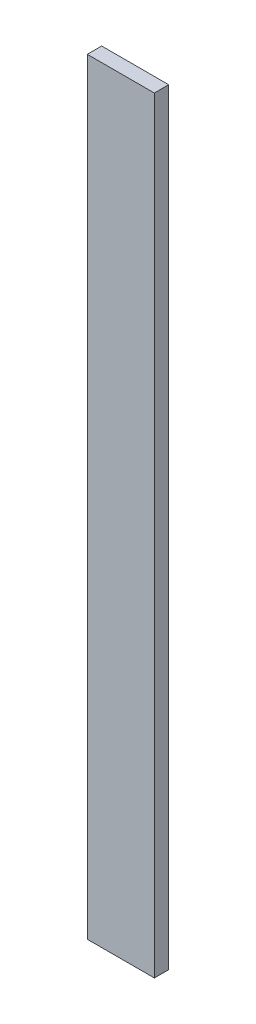
ISO-10303-21;
HEADER;
FILE_DESCRIPTION(('STEP AP214'),'2;1');
FILE_NAME('part.step','',(''),(''),'','','');
FILE_SCHEMA(('AUTOMOTIVE_DESIGN { 1 0 10303 214 1 1 1 1 }'));
ENDSEC;
DATA;
#1=APPLICATION_CONTEXT('core data for automotive mechanical design processes');
#2=APPLICATION_PROTOCOL_DEFINITION('international standard','automotive_design',2000,#1);
#3=PRODUCT_CONTEXT('',#1,'mechanical');
#4=PRODUCT('Part','Part','',(#3));
#5=PRODUCT_RELATED_PRODUCT_CATEGORY('part','',(#4));
#6=PRODUCT_DEFINITION_FORMATION('','',#4);
#7=PRODUCT_DEFINITION_CONTEXT('part definition',#1,'design');
#8=PRODUCT_DEFINITION('design','',#6,#7);
#9=PRODUCT_DEFINITION_SHAPE('','',#8);
#10=(LENGTH_UNIT() NAMED_UNIT(*) SI_UNIT(.MILLI.,.METRE.));
#11=(NAMED_UNIT(*) PLANE_ANGLE_UNIT() SI_UNIT($,.RADIAN.));
#12=(NAMED_UNIT(*) SI_UNIT($,.STERADIAN.) SOLID_ANGLE_UNIT());
#13=UNCERTAINTY_MEASURE_WITH_UNIT(LENGTH_MEASURE(1.E-05),#10,'distance_accuracy_value','');
#14=(GEOMETRIC_REPRESENTATION_CONTEXT(3) GLOBAL_UNCERTAINTY_ASSIGNED_CONTEXT((#13)) GLOBAL_UNIT_ASSIGNED_CONTEXT((#10,
#11,#12)) REPRESENTATION_CONTEXT('',''));
#15=CARTESIAN_POINT('',(0.,0.,0.));
#16=DIRECTION('',(0.,0.,1.));
#17=DIRECTION('',(1.,0.,0.));
#18=AXIS2_PLACEMENT_3D('',#15,#16,#17);
#19=CARTESIAN_POINT('',(0.,0.,15.));
#20=DIRECTION('',(0.,-1.,0.));
#21=DIRECTION('',(0.,0.,-1.));
#22=AXIS2_PLACEMENT_3D('',#19,#20,#21);
#23=PLANE('',#22);
#24=DIRECTION('',(-1.,0.,0.));
#25=VECTOR('',#24,1.);
#26=CARTESIAN_POINT('',(0.,0.,0.));
#27=LINE('',#26,#25);
#28=CARTESIAN_POINT('',(0.,0.,0.));
#29=VERTEX_POINT('',#28);
#30=CARTESIAN_POINT('',(-70.,0.,0.));
#31=VERTEX_POINT('',#30);
#32=EDGE_CURVE('E96',#29,#31,#27,.T.);
#33=ORIENTED_EDGE('',*,*,#32,.T.);
#34=DIRECTION('',(0.,0.,-1.));
#35=VECTOR('',#34,1.);
#36=CARTESIAN_POINT('',(-70.,0.,15.));
#37=LINE('',#36,#35);
#38=CARTESIAN_POINT('',(-70.,0.,15.));
#39=VERTEX_POINT('',#38);
#40=EDGE_CURVE('E11',#39,#31,#37,.T.);
#41=ORIENTED_EDGE('',*,*,#40,.F.);
#42=DIRECTION('',(-1.,0.,0.));
#43=VECTOR('',#42,1.);
#44=CARTESIAN_POINT('',(0.,0.,15.));
#45=LINE('',#44,#43);
#46=CARTESIAN_POINT('',(0.,0.,15.));
#47=VERTEX_POINT('',#46);
#48=EDGE_CURVE('E82',#47,#39,#45,.T.);
#49=ORIENTED_EDGE('',*,*,#48,.F.);
#50=DIRECTION('',(0.,0.,-1.));
#51=VECTOR('',#50,1.);
#52=CARTESIAN_POINT('',(0.,0.,15.));
#53=LINE('',#52,#51);
#54=EDGE_CURVE('E49',#47,#29,#53,.T.);
#55=ORIENTED_EDGE('',*,*,#54,.T.);
#56=EDGE_LOOP('',(#33,#41,#49,#55));
#57=FACE_BOUND('',#56,.T.);
#58=ADVANCED_FACE('F33',(#57),#23,.F.);
#59=CARTESIAN_POINT('',(-70.,0.,15.));
#60=DIRECTION('',(1.,0.,0.));
#61=DIRECTION('',(0.,1.,0.));
#62=AXIS2_PLACEMENT_3D('',#59,#60,#61);
#63=PLANE('',#62);
#64=DIRECTION('',(0.,-1.,0.));
#65=VECTOR('',#64,1.);
#66=CARTESIAN_POINT('',(-70.,0.,0.));
#67=LINE('',#66,#65);
#68=CARTESIAN_POINT('',(-69.9999999999999,-800.,0.));
#69=VERTEX_POINT('',#68);
#70=EDGE_CURVE('E87',#31,#69,#67,.T.);
#71=ORIENTED_EDGE('',*,*,#70,.T.);
#72=DIRECTION('',(0.,0.,-1.));
#73=VECTOR('',#72,1.);
#74=CARTESIAN_POINT('',(-69.9999999999999,-800.,15.));
#75=LINE('',#74,#73);
#76=CARTESIAN_POINT('',(-69.9999999999999,-800.,15.));
#77=VERTEX_POINT('',#76);
#78=EDGE_CURVE('E41',#77,#69,#75,.T.);
#79=ORIENTED_EDGE('',*,*,#78,.F.);
#80=DIRECTION('',(0.,-1.,0.));
#81=VECTOR('',#80,1.);
#82=CARTESIAN_POINT('',(-70.,0.,15.));
#83=LINE('',#82,#81);
#84=EDGE_CURVE('E74',#39,#77,#83,.T.);
#85=ORIENTED_EDGE('',*,*,#84,.F.);
#86=ORIENTED_EDGE('',*,*,#40,.T.);
#87=EDGE_LOOP('',(#71,#79,#85,#86));
#88=FACE_BOUND('',#87,.T.);
#89=ADVANCED_FACE('F86',(#88),#63,.F.);
#90=CARTESIAN_POINT('',(0.,-800.,15.));
#91=DIRECTION('',(0.,-1.,0.));
#92=DIRECTION('',(0.,0.,-1.));
#93=AXIS2_PLACEMENT_3D('',#90,#91,#92);
#94=PLANE('',#93);
#95=DIRECTION('',(-1.,0.,0.));
#96=VECTOR('',#95,1.);
#97=CARTESIAN_POINT('',(0.,-800.,0.));
#98=LINE('',#97,#96);
#99=CARTESIAN_POINT('',(0.,-800.,0.));
#100=VERTEX_POINT('',#99);
#101=EDGE_CURVE('E100',#100,#69,#98,.T.);
#102=ORIENTED_EDGE('',*,*,#101,.F.);
#103=DIRECTION('',(0.,0.,-1.));
#104=VECTOR('',#103,1.);
#105=CARTESIAN_POINT('',(0.,-800.,15.));
#106=LINE('',#105,#104);
#107=CARTESIAN_POINT('',(0.,-800.,15.));
#108=VERTEX_POINT('',#107);
#109=EDGE_CURVE('E63',#108,#100,#106,.T.);
#110=ORIENTED_EDGE('',*,*,#109,.F.);
#111=DIRECTION('',(-1.,0.,0.));
#112=VECTOR('',#111,1.);
#113=CARTESIAN_POINT('',(0.,-800.,15.));
#114=LINE('',#113,#112);
#115=EDGE_CURVE('E81',#108,#77,#114,.T.);
#116=ORIENTED_EDGE('',*,*,#115,.T.);
#117=ORIENTED_EDGE('',*,*,#78,.T.);
#118=EDGE_LOOP('',(#102,#110,#116,#117));
#119=FACE_BOUND('',#118,.T.);
#120=ADVANCED_FACE('F90',(#119),#94,.T.);
#121=CARTESIAN_POINT('',(0.,0.,15.));
#122=DIRECTION('',(1.,0.,0.));
#123=DIRECTION('',(0.,1.,0.));
#124=AXIS2_PLACEMENT_3D('',#121,#122,#123);
#125=PLANE('',#124);
#126=DIRECTION('',(0.,-1.,0.));
#127=VECTOR('',#126,1.);
#128=CARTESIAN_POINT('',(0.,0.,0.));
#129=LINE('',#128,#127);
#130=EDGE_CURVE('E102',#29,#100,#129,.T.);
#131=ORIENTED_EDGE('',*,*,#130,.F.);
#132=ORIENTED_EDGE('',*,*,#54,.F.);
#133=DIRECTION('',(0.,-1.,0.));
#134=VECTOR('',#133,1.);
#135=CARTESIAN_POINT('',(0.,0.,15.));
#136=LINE('',#135,#134);
#137=EDGE_CURVE('E91',#47,#108,#136,.T.);
#138=ORIENTED_EDGE('',*,*,#137,.T.);
#139=ORIENTED_EDGE('',*,*,#109,.T.);
#140=EDGE_LOOP('',(#131,#132,#138,#139));
#141=FACE_BOUND('',#140,.T.);
#142=ADVANCED_FACE('F175',(#141),#125,.T.);
#143=CARTESIAN_POINT('',(0.,0.,15.));
#144=DIRECTION('',(0.,0.,1.));
#145=DIRECTION('',(1.,0.,0.));
#146=AXIS2_PLACEMENT_3D('',#143,#144,#145);
#147=PLANE('',#146);
#148=ORIENTED_EDGE('',*,*,#48,.T.);
#149=ORIENTED_EDGE('',*,*,#84,.T.);
#150=ORIENTED_EDGE('',*,*,#115,.F.);
#151=ORIENTED_EDGE('',*,*,#137,.F.);
#152=EDGE_LOOP('',(#148,#149,#150,#151));
#153=FACE_BOUND('',#152,.T.);
#154=ADVANCED_FACE('F78',(#153),#147,.T.);
#155=CARTESIAN_POINT('',(0.,0.,0.));
#156=DIRECTION('',(0.,0.,1.));
#157=DIRECTION('',(1.,0.,0.));
#158=AXIS2_PLACEMENT_3D('',#155,#156,#157);
#159=PLANE('',#158);
#160=CARTESIAN_POINT('',(-35.,-30.,0.));
#161=DIRECTION('',(0.,0.,-1.));
#162=DIRECTION('',(-1.,0.,0.));
#163=AXIS2_PLACEMENT_3D('',#160,#161,#162);
#164=CIRCLE('',#163,10.);
#165=CARTESIAN_POINT('',(-45.,-30.,0.));
#166=VERTEX_POINT('',#165);
#167=EDGE_CURVE('E144',#166,#166,#164,.T.);
#168=ORIENTED_EDGE('',*,*,#167,.F.);
#169=EDGE_LOOP('',(#168));
#170=FACE_BOUND('',#169,.T.);
#171=CARTESIAN_POINT('',(-35.0000000000013,-150.,0.));
#172=DIRECTION('',(0.,0.,-1.));
#173=DIRECTION('',(-1.,0.,0.));
#174=AXIS2_PLACEMENT_3D('',#171,#172,#173);
#175=CIRCLE('',#174,10.);
#176=CARTESIAN_POINT('',(-45.0000000000013,-150.,0.));
#177=VERTEX_POINT('',#176);
#178=EDGE_CURVE('E141',#177,#177,#175,.T.);
#179=ORIENTED_EDGE('',*,*,#178,.F.);
#180=EDGE_LOOP('',(#179));
#181=FACE_BOUND('',#180,.T.);
#182=CARTESIAN_POINT('',(-35.0000000000025,-270.,0.));
#183=DIRECTION('',(0.,0.,-1.));
#184=DIRECTION('',(-1.,0.,0.));
#185=AXIS2_PLACEMENT_3D('',#182,#183,#184);
#186=CIRCLE('',#185,10.);
#187=CARTESIAN_POINT('',(-45.0000000000025,-270.,0.));
#188=VERTEX_POINT('',#187);
#189=EDGE_CURVE('E135',#188,#188,#186,.T.);
#190=ORIENTED_EDGE('',*,*,#189,.F.);
#191=EDGE_LOOP('',(#190));
#192=FACE_BOUND('',#191,.T.);
#193=CARTESIAN_POINT('',(-35.0000000000038,-390.,0.));
#194=DIRECTION('',(0.,0.,-1.));
#195=DIRECTION('',(-1.,0.,0.));
#196=AXIS2_PLACEMENT_3D('',#193,#194,#195);
#197=CIRCLE('',#196,10.);
#198=CARTESIAN_POINT('',(-45.0000000000038,-390.,0.));
#199=VERTEX_POINT('',#198);
#200=EDGE_CURVE('E129',#199,#199,#197,.T.);
#201=ORIENTED_EDGE('',*,*,#200,.F.);
#202=EDGE_LOOP('',(#201));
#203=FACE_BOUND('',#202,.T.);
#204=CARTESIAN_POINT('',(-35.000000000005,-510.,0.));
#205=DIRECTION('',(0.,0.,-1.));
#206=DIRECTION('',(-1.,0.,0.));
#207=AXIS2_PLACEMENT_3D('',#204,#205,#206);
#208=CIRCLE('',#207,10.);
#209=CARTESIAN_POINT('',(-45.000000000005,-510.,0.));
#210=VERTEX_POINT('',#209);
#211=EDGE_CURVE('E123',#210,#210,#208,.T.);
#212=ORIENTED_EDGE('',*,*,#211,.F.);
#213=EDGE_LOOP('',(#212));
#214=FACE_BOUND('',#213,.T.);
#215=CARTESIAN_POINT('',(-35.0000000000063,-630.,0.));
#216=DIRECTION('',(0.,0.,-1.));
#217=DIRECTION('',(-1.,0.,0.));
#218=AXIS2_PLACEMENT_3D('',#215,#216,#217);
#219=CIRCLE('',#218,10.);
#220=CARTESIAN_POINT('',(-45.0000000000063,-630.,0.));
#221=VERTEX_POINT('',#220);
#222=EDGE_CURVE('E117',#221,#221,#219,.T.);
#223=ORIENTED_EDGE('',*,*,#222,.F.);
#224=EDGE_LOOP('',(#223));
#225=FACE_BOUND('',#224,.T.);
#226=CARTESIAN_POINT('',(-35.0000000000075,-750.,0.));
#227=DIRECTION('',(0.,0.,-1.));
#228=DIRECTION('',(-1.,0.,0.));
#229=AXIS2_PLACEMENT_3D('',#226,#227,#228);
#230=CIRCLE('',#229,10.);
#231=CARTESIAN_POINT('',(-45.0000000000075,-750.,0.));
#232=VERTEX_POINT('',#231);
#233=EDGE_CURVE('E111',#232,#232,#230,.T.);
#234=ORIENTED_EDGE('',*,*,#233,.F.);
#235=EDGE_LOOP('',(#234));
#236=FACE_BOUND('',#235,.T.);
#237=ORIENTED_EDGE('',*,*,#32,.F.);
#238=ORIENTED_EDGE('',*,*,#130,.T.);
#239=ORIENTED_EDGE('',*,*,#101,.T.);
#240=ORIENTED_EDGE('',*,*,#70,.F.);
#241=EDGE_LOOP('',(#237,#238,#239,#240));
#242=FACE_BOUND('',#241,.T.);
#243=ADVANCED_FACE('F159',(#170,#181,#192,#203,#214,#225,#236,#242),#159,.F.);
#244=CARTESIAN_POINT('',(-35.0000000000075,-750.,8.));
#245=DIRECTION('',(0.,0.,-1.));
#246=DIRECTION('',(-1.,0.,0.));
#247=AXIS2_PLACEMENT_3D('',#244,#245,#246);
#248=CYLINDRICAL_SURFACE('',#247,10.);
#249=CARTESIAN_POINT('',(-35.0000000000075,-750.,8.));
#250=DIRECTION('',(0.,0.,-1.));
#251=DIRECTION('',(-1.,0.,0.));
#252=AXIS2_PLACEMENT_3D('',#249,#250,#251);
#253=CIRCLE('',#252,10.);
#254=CARTESIAN_POINT('',(-45.0000000000075,-750.,8.));
#255=VERTEX_POINT('',#254);
#256=EDGE_CURVE('E108',#255,#255,#253,.T.);
#257=ORIENTED_EDGE('',*,*,#256,.F.);
#258=EDGE_LOOP('',(#257));
#259=FACE_BOUND('',#258,.T.);
#260=ORIENTED_EDGE('',*,*,#233,.T.);
#261=EDGE_LOOP('',(#260));
#262=FACE_BOUND('',#261,.T.);
#263=ADVANCED_FACE('F162',(#259,#262),#248,.F.);
#264=CARTESIAN_POINT('',(-35.0000000000075,-750.,8.));
#265=DIRECTION('',(0.,0.,-1.));
#266=DIRECTION('',(-1.,0.,0.));
#267=AXIS2_PLACEMENT_3D('',#264,#265,#266);
#268=PLANE('',#267);
#269=ORIENTED_EDGE('',*,*,#256,.T.);
#270=EDGE_LOOP('',(#269));
#271=FACE_BOUND('',#270,.T.);
#272=ADVANCED_FACE('F219',(#271),#268,.T.);
#273=CARTESIAN_POINT('',(-35.0000000000063,-630.,8.));
#274=DIRECTION('',(0.,0.,-1.));
#275=DIRECTION('',(-1.,0.,0.));
#276=AXIS2_PLACEMENT_3D('',#273,#274,#275);
#277=CYLINDRICAL_SURFACE('',#276,10.);
#278=CARTESIAN_POINT('',(-35.0000000000063,-630.,8.));
#279=DIRECTION('',(0.,0.,-1.));
#280=DIRECTION('',(-1.,0.,0.));
#281=AXIS2_PLACEMENT_3D('',#278,#279,#280);
#282=CIRCLE('',#281,10.);
#283=CARTESIAN_POINT('',(-45.0000000000063,-630.,8.));
#284=VERTEX_POINT('',#283);
#285=EDGE_CURVE('E114',#284,#284,#282,.T.);
#286=ORIENTED_EDGE('',*,*,#285,.F.);
#287=EDGE_LOOP('',(#286));
#288=FACE_BOUND('',#287,.T.);
#289=ORIENTED_EDGE('',*,*,#222,.T.);
#290=EDGE_LOOP('',(#289));
#291=FACE_BOUND('',#290,.T.);
#292=ADVANCED_FACE('F229',(#288,#291),#277,.F.);
#293=CARTESIAN_POINT('',(-35.0000000000063,-630.,8.));
#294=DIRECTION('',(0.,0.,-1.));
#295=DIRECTION('',(-1.,0.,0.));
#296=AXIS2_PLACEMENT_3D('',#293,#294,#295);
#297=PLANE('',#296);
#298=ORIENTED_EDGE('',*,*,#285,.T.);
#299=EDGE_LOOP('',(#298));
#300=FACE_BOUND('',#299,.T.);
#301=ADVANCED_FACE('F239',(#300),#297,.T.);
#302=CARTESIAN_POINT('',(-35.000000000005,-510.,8.));
#303=DIRECTION('',(0.,0.,-1.));
#304=DIRECTION('',(-1.,0.,0.));
#305=AXIS2_PLACEMENT_3D('',#302,#303,#304);
#306=CYLINDRICAL_SURFACE('',#305,10.);
#307=CARTESIAN_POINT('',(-35.000000000005,-510.,8.));
#308=DIRECTION('',(0.,0.,-1.));
#309=DIRECTION('',(-1.,0.,0.));
#310=AXIS2_PLACEMENT_3D('',#307,#308,#309);
#311=CIRCLE('',#310,10.);
#312=CARTESIAN_POINT('',(-45.000000000005,-510.,8.));
#313=VERTEX_POINT('',#312);
#314=EDGE_CURVE('E120',#313,#313,#311,.T.);
#315=ORIENTED_EDGE('',*,*,#314,.F.);
#316=EDGE_LOOP('',(#315));
#317=FACE_BOUND('',#316,.T.);
#318=ORIENTED_EDGE('',*,*,#211,.T.);
#319=EDGE_LOOP('',(#318));
#320=FACE_BOUND('',#319,.T.);
#321=ADVANCED_FACE('F249',(#317,#320),#306,.F.);
#322=CARTESIAN_POINT('',(-35.000000000005,-510.,8.));
#323=DIRECTION('',(0.,0.,-1.));
#324=DIRECTION('',(-1.,0.,0.));
#325=AXIS2_PLACEMENT_3D('',#322,#323,#324);
#326=PLANE('',#325);
#327=ORIENTED_EDGE('',*,*,#314,.T.);
#328=EDGE_LOOP('',(#327));
#329=FACE_BOUND('',#328,.T.);
#330=ADVANCED_FACE('F259',(#329),#326,.T.);
#331=CARTESIAN_POINT('',(-35.0000000000038,-390.,8.));
#332=DIRECTION('',(0.,0.,-1.));
#333=DIRECTION('',(-1.,0.,0.));
#334=AXIS2_PLACEMENT_3D('',#331,#332,#333);
#335=CYLINDRICAL_SURFACE('',#334,10.);
#336=CARTESIAN_POINT('',(-35.0000000000038,-390.,8.));
#337=DIRECTION('',(0.,0.,-1.));
#338=DIRECTION('',(-1.,0.,0.));
#339=AXIS2_PLACEMENT_3D('',#336,#337,#338);
#340=CIRCLE('',#339,10.);
#341=CARTESIAN_POINT('',(-45.0000000000038,-390.,8.));
#342=VERTEX_POINT('',#341);
#343=EDGE_CURVE('E126',#342,#342,#340,.T.);
#344=ORIENTED_EDGE('',*,*,#343,.F.);
#345=EDGE_LOOP('',(#344));
#346=FACE_BOUND('',#345,.T.);
#347=ORIENTED_EDGE('',*,*,#200,.T.);
#348=EDGE_LOOP('',(#347));
#349=FACE_BOUND('',#348,.T.);
#350=ADVANCED_FACE('F269',(#346,#349),#335,.F.);
#351=CARTESIAN_POINT('',(-35.0000000000038,-390.,8.));
#352=DIRECTION('',(0.,0.,-1.));
#353=DIRECTION('',(-1.,0.,0.));
#354=AXIS2_PLACEMENT_3D('',#351,#352,#353);
#355=PLANE('',#354);
#356=ORIENTED_EDGE('',*,*,#343,.T.);
#357=EDGE_LOOP('',(#356));
#358=FACE_BOUND('',#357,.T.);
#359=ADVANCED_FACE('F279',(#358),#355,.T.);
#360=CARTESIAN_POINT('',(-35.0000000000025,-270.,8.));
#361=DIRECTION('',(0.,0.,-1.));
#362=DIRECTION('',(-1.,0.,0.));
#363=AXIS2_PLACEMENT_3D('',#360,#361,#362);
#364=CYLINDRICAL_SURFACE('',#363,10.);
#365=CARTESIAN_POINT('',(-35.0000000000025,-270.,8.));
#366=DIRECTION('',(0.,0.,-1.));
#367=DIRECTION('',(-1.,0.,0.));
#368=AXIS2_PLACEMENT_3D('',#365,#366,#367);
#369=CIRCLE('',#368,10.);
#370=CARTESIAN_POINT('',(-45.0000000000025,-270.,8.));
#371=VERTEX_POINT('',#370);
#372=EDGE_CURVE('E132',#371,#371,#369,.T.);
#373=ORIENTED_EDGE('',*,*,#372,.F.);
#374=EDGE_LOOP('',(#373));
#375=FACE_BOUND('',#374,.T.);
#376=ORIENTED_EDGE('',*,*,#189,.T.);
#377=EDGE_LOOP('',(#376));
#378=FACE_BOUND('',#377,.T.);
#379=ADVANCED_FACE('F289',(#375,#378),#364,.F.);
#380=CARTESIAN_POINT('',(-35.0000000000025,-270.,8.));
#381=DIRECTION('',(0.,0.,-1.));
#382=DIRECTION('',(-1.,0.,0.));
#383=AXIS2_PLACEMENT_3D('',#380,#381,#382);
#384=PLANE('',#383);
#385=ORIENTED_EDGE('',*,*,#372,.T.);
#386=EDGE_LOOP('',(#385));
#387=FACE_BOUND('',#386,.T.);
#388=ADVANCED_FACE('F299',(#387),#384,.T.);
#389=CARTESIAN_POINT('',(-35.0000000000013,-150.,8.));
#390=DIRECTION('',(0.,0.,-1.));
#391=DIRECTION('',(-1.,0.,0.));
#392=AXIS2_PLACEMENT_3D('',#389,#390,#391);
#393=CYLINDRICAL_SURFACE('',#392,10.);
#394=CARTESIAN_POINT('',(-35.0000000000013,-150.,8.));
#395=DIRECTION('',(0.,0.,-1.));
#396=DIRECTION('',(-1.,0.,0.));
#397=AXIS2_PLACEMENT_3D('',#394,#395,#396);
#398=CIRCLE('',#397,10.);
#399=CARTESIAN_POINT('',(-45.0000000000013,-150.,8.));
#400=VERTEX_POINT('',#399);
#401=EDGE_CURVE('E138',#400,#400,#398,.T.);
#402=ORIENTED_EDGE('',*,*,#401,.F.);
#403=EDGE_LOOP('',(#402));
#404=FACE_BOUND('',#403,.T.);
#405=ORIENTED_EDGE('',*,*,#178,.T.);
#406=EDGE_LOOP('',(#405));
#407=FACE_BOUND('',#406,.T.);
#408=ADVANCED_FACE('F309',(#404,#407),#393,.F.);
#409=CARTESIAN_POINT('',(-35.0000000000013,-150.,8.));
#410=DIRECTION('',(0.,0.,-1.));
#411=DIRECTION('',(-1.,0.,0.));
#412=AXIS2_PLACEMENT_3D('',#409,#410,#411);
#413=PLANE('',#412);
#414=ORIENTED_EDGE('',*,*,#401,.T.);
#415=EDGE_LOOP('',(#414));
#416=FACE_BOUND('',#415,.T.);
#417=ADVANCED_FACE('F155',(#416),#413,.T.);
#418=CARTESIAN_POINT('',(-35.,-30.,8.));
#419=DIRECTION('',(0.,0.,-1.));
#420=DIRECTION('',(-1.,0.,0.));
#421=AXIS2_PLACEMENT_3D('',#418,#419,#420);
#422=CYLINDRICAL_SURFACE('',#421,10.);
#423=CARTESIAN_POINT('',(-35.,-30.,8.));
#424=DIRECTION('',(0.,0.,-1.));
#425=DIRECTION('',(-1.,0.,0.));
#426=AXIS2_PLACEMENT_3D('',#423,#424,#425);
#427=CIRCLE('',#426,10.);
#428=CARTESIAN_POINT('',(-45.,-30.,8.));
#429=VERTEX_POINT('',#428);
#430=EDGE_CURVE('E98',#429,#429,#427,.T.);
#431=ORIENTED_EDGE('',*,*,#430,.F.);
#432=EDGE_LOOP('',(#431));
#433=FACE_BOUND('',#432,.T.);
#434=ORIENTED_EDGE('',*,*,#167,.T.);
#435=EDGE_LOOP('',(#434));
#436=FACE_BOUND('',#435,.T.);
#437=ADVANCED_FACE('F152',(#433,#436),#422,.F.);
#438=CARTESIAN_POINT('',(-35.,-30.,8.));
#439=DIRECTION('',(0.,0.,-1.));
#440=DIRECTION('',(-1.,0.,0.));
#441=AXIS2_PLACEMENT_3D('',#438,#439,#440);
#442=PLANE('',#441);
#443=ORIENTED_EDGE('',*,*,#430,.T.);
#444=EDGE_LOOP('',(#443));
#445=FACE_BOUND('',#444,.T.);
#446=ADVANCED_FACE('F150',(#445),#442,.T.);
#447=CLOSED_SHELL('',(#58,#89,#120,#142,#154,#243,#263,#272,#292,#301,#321,#330,#350,#359,#379,
#388,#408,#417,#437,#446));
#448=MANIFOLD_SOLID_BREP('B2',#447);
#449=ADVANCED_BREP_SHAPE_REPRESENTATION('',(#18,#448),#14);
#450=SHAPE_DEFINITION_REPRESENTATION(#9,#449);
ENDSEC;
END-ISO-10303-21;
